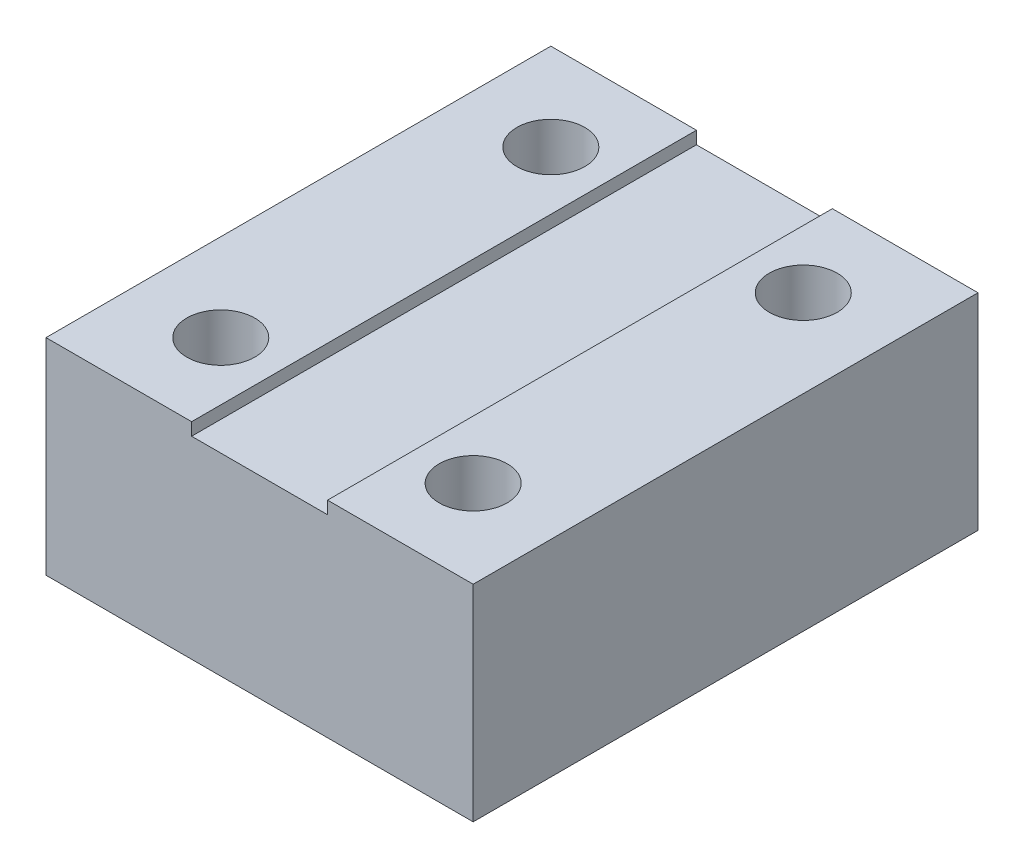
ISO-10303-21;
HEADER;
FILE_DESCRIPTION(('STEP AP214'),'2;1');
FILE_NAME('part.step','',(''),(''),'','','');
FILE_SCHEMA(('AUTOMOTIVE_DESIGN { 1 0 10303 214 1 1 1 1 }'));
ENDSEC;
DATA;
#1=APPLICATION_CONTEXT('core data for automotive mechanical design processes');
#2=APPLICATION_PROTOCOL_DEFINITION('international standard','automotive_design',2000,#1);
#3=PRODUCT_CONTEXT('',#1,'mechanical');
#4=PRODUCT('Part','Part','',(#3));
#5=PRODUCT_RELATED_PRODUCT_CATEGORY('part','',(#4));
#6=PRODUCT_DEFINITION_FORMATION('','',#4);
#7=PRODUCT_DEFINITION_CONTEXT('part definition',#1,'design');
#8=PRODUCT_DEFINITION('design','',#6,#7);
#9=PRODUCT_DEFINITION_SHAPE('','',#8);
#10=(LENGTH_UNIT() NAMED_UNIT(*) SI_UNIT(.MILLI.,.METRE.));
#11=(NAMED_UNIT(*) PLANE_ANGLE_UNIT() SI_UNIT($,.RADIAN.));
#12=(NAMED_UNIT(*) SI_UNIT($,.STERADIAN.) SOLID_ANGLE_UNIT());
#13=UNCERTAINTY_MEASURE_WITH_UNIT(LENGTH_MEASURE(1.E-05),#10,'distance_accuracy_value','');
#14=(GEOMETRIC_REPRESENTATION_CONTEXT(3) GLOBAL_UNCERTAINTY_ASSIGNED_CONTEXT((#13)) GLOBAL_UNIT_ASSIGNED_CONTEXT((#10,
#11,#12)) REPRESENTATION_CONTEXT('',''));
#15=CARTESIAN_POINT('',(0.,0.,0.));
#16=DIRECTION('',(0.,0.,1.));
#17=DIRECTION('',(1.,0.,0.));
#18=AXIS2_PLACEMENT_3D('',#15,#16,#17);
#19=CARTESIAN_POINT('',(-11.,5.3,13.));
#20=DIRECTION('',(0.,-1.,0.));
#21=DIRECTION('',(0.,0.,-1.));
#22=AXIS2_PLACEMENT_3D('',#19,#20,#21);
#23=PLANE('',#22);
#24=CARTESIAN_POINT('',(-6.5,5.3,8.5));
#25=DIRECTION('',(0.,1.,0.));
#26=DIRECTION('',(0.,0.,1.));
#27=AXIS2_PLACEMENT_3D('',#24,#25,#26);
#28=CIRCLE('',#27,1.75);
#29=CARTESIAN_POINT('',(-6.5,5.3,10.25));
#30=VERTEX_POINT('',#29);
#31=EDGE_CURVE('E154',#30,#30,#28,.T.);
#32=ORIENTED_EDGE('',*,*,#31,.F.);
#33=EDGE_LOOP('',(#32));
#34=FACE_BOUND('',#33,.T.);
#35=CARTESIAN_POINT('',(-6.5,5.3,-8.5));
#36=DIRECTION('',(0.,1.,0.));
#37=DIRECTION('',(0.,0.,1.));
#38=AXIS2_PLACEMENT_3D('',#35,#36,#37);
#39=CIRCLE('',#38,1.75);
#40=CARTESIAN_POINT('',(-6.5,5.3,-6.75));
#41=VERTEX_POINT('',#40);
#42=EDGE_CURVE('E157',#41,#41,#39,.T.);
#43=ORIENTED_EDGE('',*,*,#42,.F.);
#44=EDGE_LOOP('',(#43));
#45=FACE_BOUND('',#44,.T.);
#46=DIRECTION('',(0.,0.,-1.));
#47=VECTOR('',#46,1.);
#48=CARTESIAN_POINT('',(-3.5,5.3,13.));
#49=LINE('',#48,#47);
#50=CARTESIAN_POINT('',(-3.5,5.3,13.));
#51=VERTEX_POINT('',#50);
#52=CARTESIAN_POINT('',(-3.5,5.3,-13.));
#53=VERTEX_POINT('',#52);
#54=EDGE_CURVE('E120',#51,#53,#49,.T.);
#55=ORIENTED_EDGE('',*,*,#54,.T.);
#56=DIRECTION('',(-1.,0.,0.));
#57=VECTOR('',#56,1.);
#58=CARTESIAN_POINT('',(-11.,5.3,-13.));
#59=LINE('',#58,#57);
#60=CARTESIAN_POINT('',(-11.,5.3,-13.));
#61=VERTEX_POINT('',#60);
#62=EDGE_CURVE('E174',#53,#61,#59,.T.);
#63=ORIENTED_EDGE('',*,*,#62,.T.);
#64=DIRECTION('',(0.,0.,-1.));
#65=VECTOR('',#64,1.);
#66=CARTESIAN_POINT('',(-11.,5.3,13.));
#67=LINE('',#66,#65);
#68=CARTESIAN_POINT('',(-11.,5.3,13.));
#69=VERTEX_POINT('',#68);
#70=EDGE_CURVE('E41',#69,#61,#67,.T.);
#71=ORIENTED_EDGE('',*,*,#70,.F.);
#72=DIRECTION('',(-1.,0.,0.));
#73=VECTOR('',#72,1.);
#74=CARTESIAN_POINT('',(-11.,5.3,13.));
#75=LINE('',#74,#73);
#76=EDGE_CURVE('E166',#51,#69,#75,.T.);
#77=ORIENTED_EDGE('',*,*,#76,.F.);
#78=EDGE_LOOP('',(#55,#63,#71,#77));
#79=FACE_BOUND('',#78,.T.);
#80=ADVANCED_FACE('F33',(#34,#45,#79),#23,.F.);
#81=CARTESIAN_POINT('',(0.,0.,13.));
#82=DIRECTION('',(0.,0.,-1.));
#83=DIRECTION('',(-1.,0.,0.));
#84=AXIS2_PLACEMENT_3D('',#81,#82,#83);
#85=PLANE('',#84);
#86=DIRECTION('',(0.,1.,0.));
#87=VECTOR('',#86,1.);
#88=CARTESIAN_POINT('',(-3.5,4.65,13.));
#89=LINE('',#88,#87);
#90=CARTESIAN_POINT('',(-3.5,4.65,13.));
#91=VERTEX_POINT('',#90);
#92=EDGE_CURVE('E117',#91,#51,#89,.T.);
#93=ORIENTED_EDGE('',*,*,#92,.T.);
#94=ORIENTED_EDGE('',*,*,#76,.T.);
#95=DIRECTION('',(0.,-1.,0.));
#96=VECTOR('',#95,1.);
#97=CARTESIAN_POINT('',(-11.,-5.3,13.));
#98=LINE('',#97,#96);
#99=CARTESIAN_POINT('',(-11.,-5.3,13.));
#100=VERTEX_POINT('',#99);
#101=EDGE_CURVE('E168',#69,#100,#98,.T.);
#102=ORIENTED_EDGE('',*,*,#101,.T.);
#103=DIRECTION('',(1.,0.,0.));
#104=VECTOR('',#103,1.);
#105=CARTESIAN_POINT('',(-11.,-5.3,13.));
#106=LINE('',#105,#104);
#107=CARTESIAN_POINT('',(11.,-5.3,13.));
#108=VERTEX_POINT('',#107);
#109=EDGE_CURVE('E57',#100,#108,#106,.T.);
#110=ORIENTED_EDGE('',*,*,#109,.T.);
#111=DIRECTION('',(0.,1.,0.));
#112=VECTOR('',#111,1.);
#113=CARTESIAN_POINT('',(11.,-5.3,13.));
#114=LINE('',#113,#112);
#115=CARTESIAN_POINT('',(11.,5.3,13.));
#116=VERTEX_POINT('',#115);
#117=EDGE_CURVE('E164',#108,#116,#114,.T.);
#118=ORIENTED_EDGE('',*,*,#117,.T.);
#119=CARTESIAN_POINT('',(3.5,5.3,13.));
#120=VERTEX_POINT('',#119);
#121=EDGE_CURVE('E85',#116,#120,#75,.T.);
#122=ORIENTED_EDGE('',*,*,#121,.T.);
#123=DIRECTION('',(0.,1.,0.));
#124=VECTOR('',#123,1.);
#125=CARTESIAN_POINT('',(3.5,4.65,13.));
#126=LINE('',#125,#124);
#127=CARTESIAN_POINT('',(3.5,4.65,13.));
#128=VERTEX_POINT('',#127);
#129=EDGE_CURVE('E127',#128,#120,#126,.T.);
#130=ORIENTED_EDGE('',*,*,#129,.F.);
#131=DIRECTION('',(-1.,0.,0.));
#132=VECTOR('',#131,1.);
#133=CARTESIAN_POINT('',(3.5,4.65,13.));
#134=LINE('',#133,#132);
#135=EDGE_CURVE('E110',#128,#91,#134,.T.);
#136=ORIENTED_EDGE('',*,*,#135,.T.);
#137=EDGE_LOOP('',(#93,#94,#102,#110,#118,#122,#130,#136));
#138=FACE_BOUND('',#137,.T.);
#139=ADVANCED_FACE('F126',(#138),#85,.F.);
#140=CARTESIAN_POINT('',(0.,0.,-13.));
#141=DIRECTION('',(0.,0.,-1.));
#142=DIRECTION('',(-1.,0.,0.));
#143=AXIS2_PLACEMENT_3D('',#140,#141,#142);
#144=PLANE('',#143);
#145=ORIENTED_EDGE('',*,*,#62,.F.);
#146=DIRECTION('',(0.,1.,0.));
#147=VECTOR('',#146,1.);
#148=CARTESIAN_POINT('',(-3.5,4.65,-13.));
#149=LINE('',#148,#147);
#150=CARTESIAN_POINT('',(-3.5,4.65,-13.));
#151=VERTEX_POINT('',#150);
#152=EDGE_CURVE('E123',#151,#53,#149,.T.);
#153=ORIENTED_EDGE('',*,*,#152,.F.);
#154=DIRECTION('',(-1.,0.,0.));
#155=VECTOR('',#154,1.);
#156=CARTESIAN_POINT('',(3.5,4.65,-13.));
#157=LINE('',#156,#155);
#158=CARTESIAN_POINT('',(3.5,4.65,-13.));
#159=VERTEX_POINT('',#158);
#160=EDGE_CURVE('E112',#159,#151,#157,.T.);
#161=ORIENTED_EDGE('',*,*,#160,.F.);
#162=DIRECTION('',(0.,1.,0.));
#163=VECTOR('',#162,1.);
#164=CARTESIAN_POINT('',(3.5,4.65,-13.));
#165=LINE('',#164,#163);
#166=CARTESIAN_POINT('',(3.5,5.3,-13.));
#167=VERTEX_POINT('',#166);
#168=EDGE_CURVE('E136',#159,#167,#165,.T.);
#169=ORIENTED_EDGE('',*,*,#168,.T.);
#170=CARTESIAN_POINT('',(11.,5.3,-13.));
#171=VERTEX_POINT('',#170);
#172=EDGE_CURVE('E175',#171,#167,#59,.T.);
#173=ORIENTED_EDGE('',*,*,#172,.F.);
#174=DIRECTION('',(0.,1.,0.));
#175=VECTOR('',#174,1.);
#176=CARTESIAN_POINT('',(11.,-5.3,-13.));
#177=LINE('',#176,#175);
#178=CARTESIAN_POINT('',(11.,-5.3,-13.));
#179=VERTEX_POINT('',#178);
#180=EDGE_CURVE('E163',#179,#171,#177,.T.);
#181=ORIENTED_EDGE('',*,*,#180,.F.);
#182=DIRECTION('',(1.,0.,0.));
#183=VECTOR('',#182,1.);
#184=CARTESIAN_POINT('',(-11.,-5.3,-13.));
#185=LINE('',#184,#183);
#186=CARTESIAN_POINT('',(-11.,-5.3,-13.));
#187=VERTEX_POINT('',#186);
#188=EDGE_CURVE('E78',#187,#179,#185,.T.);
#189=ORIENTED_EDGE('',*,*,#188,.F.);
#190=DIRECTION('',(0.,-1.,0.));
#191=VECTOR('',#190,1.);
#192=CARTESIAN_POINT('',(-11.,-5.3,-13.));
#193=LINE('',#192,#191);
#194=EDGE_CURVE('E178',#61,#187,#193,.T.);
#195=ORIENTED_EDGE('',*,*,#194,.F.);
#196=EDGE_LOOP('',(#145,#153,#161,#169,#173,#181,#189,#195));
#197=FACE_BOUND('',#196,.T.);
#198=ADVANCED_FACE('F193',(#197),#144,.T.);
#199=CARTESIAN_POINT('',(11.,-5.3,13.));
#200=DIRECTION('',(-1.,0.,0.));
#201=DIRECTION('',(0.,0.,1.));
#202=AXIS2_PLACEMENT_3D('',#199,#200,#201);
#203=PLANE('',#202);
#204=ORIENTED_EDGE('',*,*,#180,.T.);
#205=DIRECTION('',(0.,0.,-1.));
#206=VECTOR('',#205,1.);
#207=CARTESIAN_POINT('',(11.,5.3,13.));
#208=LINE('',#207,#206);
#209=EDGE_CURVE('E11',#116,#171,#208,.T.);
#210=ORIENTED_EDGE('',*,*,#209,.F.);
#211=ORIENTED_EDGE('',*,*,#117,.F.);
#212=DIRECTION('',(0.,0.,-1.));
#213=VECTOR('',#212,1.);
#214=CARTESIAN_POINT('',(11.,-5.3,13.));
#215=LINE('',#214,#213);
#216=EDGE_CURVE('E171',#108,#179,#215,.T.);
#217=ORIENTED_EDGE('',*,*,#216,.T.);
#218=EDGE_LOOP('',(#204,#210,#211,#217));
#219=FACE_BOUND('',#218,.T.);
#220=ADVANCED_FACE('F35',(#219),#203,.F.);
#221=CARTESIAN_POINT('',(6.5,5.3,-8.5));
#222=DIRECTION('',(0.,1.,0.));
#223=DIRECTION('',(0.,0.,1.));
#224=AXIS2_PLACEMENT_3D('',#221,#222,#223);
#225=CIRCLE('',#224,1.75);
#226=CARTESIAN_POINT('',(6.5,5.3,-6.75));
#227=VERTEX_POINT('',#226);
#228=EDGE_CURVE('E142',#227,#227,#225,.T.);
#229=ORIENTED_EDGE('',*,*,#228,.F.);
#230=EDGE_LOOP('',(#229));
#231=FACE_BOUND('',#230,.T.);
#232=CARTESIAN_POINT('',(6.5,5.3,8.5));
#233=DIRECTION('',(0.,1.,0.));
#234=DIRECTION('',(0.,0.,1.));
#235=AXIS2_PLACEMENT_3D('',#232,#233,#234);
#236=CIRCLE('',#235,1.75);
#237=CARTESIAN_POINT('',(6.5,5.3,10.25));
#238=VERTEX_POINT('',#237);
#239=EDGE_CURVE('E148',#238,#238,#236,.T.);
#240=ORIENTED_EDGE('',*,*,#239,.F.);
#241=EDGE_LOOP('',(#240));
#242=FACE_BOUND('',#241,.T.);
#243=ORIENTED_EDGE('',*,*,#172,.T.);
#244=DIRECTION('',(0.,0.,-1.));
#245=VECTOR('',#244,1.);
#246=CARTESIAN_POINT('',(3.5,5.3,13.));
#247=LINE('',#246,#245);
#248=EDGE_CURVE('E128',#120,#167,#247,.T.);
#249=ORIENTED_EDGE('',*,*,#248,.F.);
#250=ORIENTED_EDGE('',*,*,#121,.F.);
#251=ORIENTED_EDGE('',*,*,#209,.T.);
#252=EDGE_LOOP('',(#243,#249,#250,#251));
#253=FACE_BOUND('',#252,.T.);
#254=ADVANCED_FACE('F210',(#231,#242,#253),#23,.F.);
#255=CARTESIAN_POINT('',(-11.,-5.3,13.));
#256=DIRECTION('',(1.,0.,0.));
#257=DIRECTION('',(0.,0.,-1.));
#258=AXIS2_PLACEMENT_3D('',#255,#256,#257);
#259=PLANE('',#258);
#260=ORIENTED_EDGE('',*,*,#194,.T.);
#261=DIRECTION('',(0.,0.,-1.));
#262=VECTOR('',#261,1.);
#263=CARTESIAN_POINT('',(-11.,-5.3,13.));
#264=LINE('',#263,#262);
#265=EDGE_CURVE('E182',#100,#187,#264,.T.);
#266=ORIENTED_EDGE('',*,*,#265,.F.);
#267=ORIENTED_EDGE('',*,*,#101,.F.);
#268=ORIENTED_EDGE('',*,*,#70,.T.);
#269=EDGE_LOOP('',(#260,#266,#267,#268));
#270=FACE_BOUND('',#269,.T.);
#271=ADVANCED_FACE('F188',(#270),#259,.F.);
#272=CARTESIAN_POINT('',(-11.,-5.3,13.));
#273=DIRECTION('',(0.,1.,0.));
#274=DIRECTION('',(0.,0.,1.));
#275=AXIS2_PLACEMENT_3D('',#272,#273,#274);
#276=PLANE('',#275);
#277=CARTESIAN_POINT('',(6.5,-5.3,-8.5));
#278=DIRECTION('',(0.,1.,0.));
#279=DIRECTION('',(0.,0.,1.));
#280=AXIS2_PLACEMENT_3D('',#277,#278,#279);
#281=CIRCLE('',#280,1.75);
#282=CARTESIAN_POINT('',(6.5,-5.3,-6.75));
#283=VERTEX_POINT('',#282);
#284=EDGE_CURVE('E122',#283,#283,#281,.F.);
#285=ORIENTED_EDGE('',*,*,#284,.F.);
#286=EDGE_LOOP('',(#285));
#287=FACE_BOUND('',#286,.T.);
#288=CARTESIAN_POINT('',(6.5,-5.3,8.5));
#289=DIRECTION('',(0.,1.,0.));
#290=DIRECTION('',(0.,0.,1.));
#291=AXIS2_PLACEMENT_3D('',#288,#289,#290);
#292=CIRCLE('',#291,1.75);
#293=CARTESIAN_POINT('',(6.5,-5.3,10.25));
#294=VERTEX_POINT('',#293);
#295=EDGE_CURVE('E145',#294,#294,#292,.F.);
#296=ORIENTED_EDGE('',*,*,#295,.F.);
#297=EDGE_LOOP('',(#296));
#298=FACE_BOUND('',#297,.T.);
#299=CARTESIAN_POINT('',(-6.5,-5.3,8.5));
#300=DIRECTION('',(0.,1.,0.));
#301=DIRECTION('',(0.,0.,1.));
#302=AXIS2_PLACEMENT_3D('',#299,#300,#301);
#303=CIRCLE('',#302,1.75);
#304=CARTESIAN_POINT('',(-6.5,-5.3,10.25));
#305=VERTEX_POINT('',#304);
#306=EDGE_CURVE('E151',#305,#305,#303,.F.);
#307=ORIENTED_EDGE('',*,*,#306,.F.);
#308=EDGE_LOOP('',(#307));
#309=FACE_BOUND('',#308,.T.);
#310=CARTESIAN_POINT('',(-6.5,-5.3,-8.5));
#311=DIRECTION('',(0.,1.,0.));
#312=DIRECTION('',(0.,0.,1.));
#313=AXIS2_PLACEMENT_3D('',#310,#311,#312);
#314=CIRCLE('',#313,1.75);
#315=CARTESIAN_POINT('',(-6.5,-5.3,-6.75));
#316=VERTEX_POINT('',#315);
#317=EDGE_CURVE('E160',#316,#316,#314,.F.);
#318=ORIENTED_EDGE('',*,*,#317,.F.);
#319=EDGE_LOOP('',(#318));
#320=FACE_BOUND('',#319,.T.);
#321=ORIENTED_EDGE('',*,*,#188,.T.);
#322=ORIENTED_EDGE('',*,*,#216,.F.);
#323=ORIENTED_EDGE('',*,*,#109,.F.);
#324=ORIENTED_EDGE('',*,*,#265,.T.);
#325=EDGE_LOOP('',(#321,#322,#323,#324));
#326=FACE_BOUND('',#325,.T.);
#327=ADVANCED_FACE('F198',(#287,#298,#309,#320,#326),#276,.F.);
#328=CARTESIAN_POINT('',(-6.5,-5.301,-8.5));
#329=DIRECTION('',(0.,1.,0.));
#330=DIRECTION('',(0.,0.,1.));
#331=AXIS2_PLACEMENT_3D('',#328,#329,#330);
#332=CYLINDRICAL_SURFACE('',#331,1.75);
#333=ORIENTED_EDGE('',*,*,#42,.T.);
#334=EDGE_LOOP('',(#333));
#335=FACE_BOUND('',#334,.T.);
#336=ORIENTED_EDGE('',*,*,#317,.T.);
#337=EDGE_LOOP('',(#336));
#338=FACE_BOUND('',#337,.T.);
#339=ADVANCED_FACE('F200',(#335,#338),#332,.F.);
#340=CARTESIAN_POINT('',(-6.5,-5.301,8.5));
#341=DIRECTION('',(0.,1.,0.));
#342=DIRECTION('',(0.,0.,1.));
#343=AXIS2_PLACEMENT_3D('',#340,#341,#342);
#344=CYLINDRICAL_SURFACE('',#343,1.75);
#345=ORIENTED_EDGE('',*,*,#31,.T.);
#346=EDGE_LOOP('',(#345));
#347=FACE_BOUND('',#346,.T.);
#348=ORIENTED_EDGE('',*,*,#306,.T.);
#349=EDGE_LOOP('',(#348));
#350=FACE_BOUND('',#349,.T.);
#351=ADVANCED_FACE('F207',(#347,#350),#344,.F.);
#352=CARTESIAN_POINT('',(6.5,-5.301,8.5));
#353=DIRECTION('',(0.,1.,0.));
#354=DIRECTION('',(0.,0.,1.));
#355=AXIS2_PLACEMENT_3D('',#352,#353,#354);
#356=CYLINDRICAL_SURFACE('',#355,1.75);
#357=ORIENTED_EDGE('',*,*,#239,.T.);
#358=EDGE_LOOP('',(#357));
#359=FACE_BOUND('',#358,.T.);
#360=ORIENTED_EDGE('',*,*,#295,.T.);
#361=EDGE_LOOP('',(#360));
#362=FACE_BOUND('',#361,.T.);
#363=ADVANCED_FACE('F245',(#359,#362),#356,.F.);
#364=CARTESIAN_POINT('',(6.5,-5.301,-8.5));
#365=DIRECTION('',(0.,1.,0.));
#366=DIRECTION('',(0.,0.,1.));
#367=AXIS2_PLACEMENT_3D('',#364,#365,#366);
#368=CYLINDRICAL_SURFACE('',#367,1.75);
#369=ORIENTED_EDGE('',*,*,#228,.T.);
#370=EDGE_LOOP('',(#369));
#371=FACE_BOUND('',#370,.T.);
#372=ORIENTED_EDGE('',*,*,#284,.T.);
#373=EDGE_LOOP('',(#372));
#374=FACE_BOUND('',#373,.T.);
#375=ADVANCED_FACE('F240',(#371,#374),#368,.F.);
#376=CARTESIAN_POINT('',(-3.5,4.65,13.));
#377=DIRECTION('',(1.,0.,0.));
#378=DIRECTION('',(0.,0.,-1.));
#379=AXIS2_PLACEMENT_3D('',#376,#377,#378);
#380=PLANE('',#379);
#381=ORIENTED_EDGE('',*,*,#54,.F.);
#382=ORIENTED_EDGE('',*,*,#92,.F.);
#383=DIRECTION('',(0.,0.,-1.));
#384=VECTOR('',#383,1.);
#385=CARTESIAN_POINT('',(-3.5,4.65,13.));
#386=LINE('',#385,#384);
#387=EDGE_CURVE('E106',#91,#151,#386,.T.);
#388=ORIENTED_EDGE('',*,*,#387,.T.);
#389=ORIENTED_EDGE('',*,*,#152,.T.);
#390=EDGE_LOOP('',(#381,#382,#388,#389));
#391=FACE_BOUND('',#390,.T.);
#392=ADVANCED_FACE('F118',(#391),#380,.T.);
#393=CARTESIAN_POINT('',(3.5,4.65,13.));
#394=DIRECTION('',(1.,0.,0.));
#395=DIRECTION('',(0.,0.,-1.));
#396=AXIS2_PLACEMENT_3D('',#393,#394,#395);
#397=PLANE('',#396);
#398=ORIENTED_EDGE('',*,*,#248,.T.);
#399=ORIENTED_EDGE('',*,*,#168,.F.);
#400=DIRECTION('',(0.,0.,-1.));
#401=VECTOR('',#400,1.);
#402=CARTESIAN_POINT('',(3.5,4.65,13.));
#403=LINE('',#402,#401);
#404=EDGE_CURVE('E48',#128,#159,#403,.T.);
#405=ORIENTED_EDGE('',*,*,#404,.F.);
#406=ORIENTED_EDGE('',*,*,#129,.T.);
#407=EDGE_LOOP('',(#398,#399,#405,#406));
#408=FACE_BOUND('',#407,.T.);
#409=ADVANCED_FACE('F232',(#408),#397,.F.);
#410=CARTESIAN_POINT('',(0.,4.65,0.));
#411=DIRECTION('',(0.,-1.,0.));
#412=DIRECTION('',(0.,0.,-1.));
#413=AXIS2_PLACEMENT_3D('',#410,#411,#412);
#414=PLANE('',#413);
#415=ORIENTED_EDGE('',*,*,#135,.F.);
#416=ORIENTED_EDGE('',*,*,#404,.T.);
#417=ORIENTED_EDGE('',*,*,#160,.T.);
#418=ORIENTED_EDGE('',*,*,#387,.F.);
#419=EDGE_LOOP('',(#415,#416,#417,#418));
#420=FACE_BOUND('',#419,.T.);
#421=ADVANCED_FACE('F108',(#420),#414,.F.);
#422=CLOSED_SHELL('',(#80,#139,#198,#220,#254,#271,#327,#339,#351,#363,#375,#392,#409,#421));
#423=MANIFOLD_SOLID_BREP('B2',#422);
#424=ADVANCED_BREP_SHAPE_REPRESENTATION('',(#18,#423),#14);
#425=SHAPE_DEFINITION_REPRESENTATION(#9,#424);
ENDSEC;
END-ISO-10303-21;
